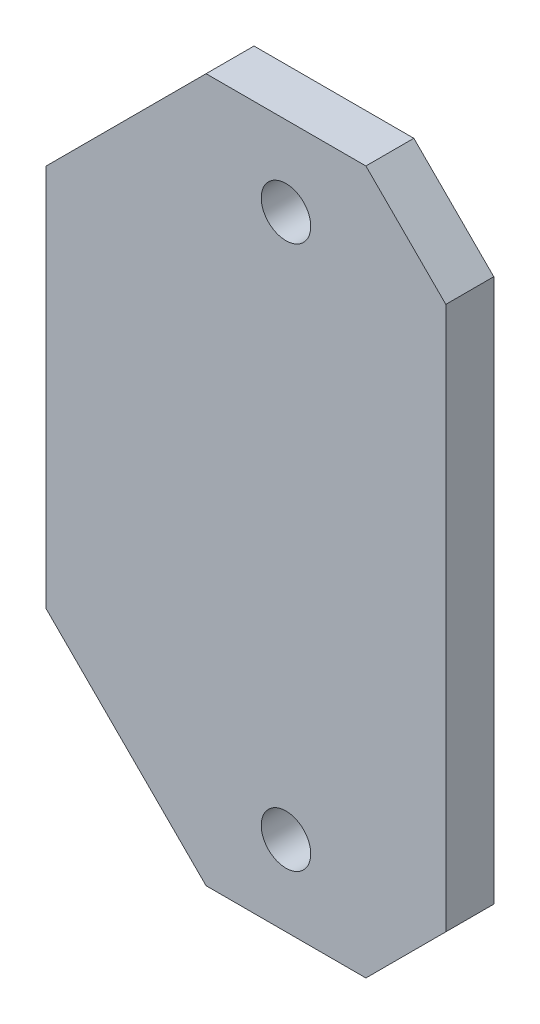
ISO-10303-21;
HEADER;
FILE_DESCRIPTION(('STEP AP214'),'2;1');
FILE_NAME('part.step','',(''),(''),'','','');
FILE_SCHEMA(('AUTOMOTIVE_DESIGN { 1 0 10303 214 1 1 1 1 }'));
ENDSEC;
DATA;
#1=APPLICATION_CONTEXT('core data for automotive mechanical design processes');
#2=APPLICATION_PROTOCOL_DEFINITION('international standard','automotive_design',2000,#1);
#3=PRODUCT_CONTEXT('',#1,'mechanical');
#4=PRODUCT('Part','Part','',(#3));
#5=PRODUCT_RELATED_PRODUCT_CATEGORY('part','',(#4));
#6=PRODUCT_DEFINITION_FORMATION('','',#4);
#7=PRODUCT_DEFINITION_CONTEXT('part definition',#1,'design');
#8=PRODUCT_DEFINITION('design','',#6,#7);
#9=PRODUCT_DEFINITION_SHAPE('','',#8);
#10=(LENGTH_UNIT() NAMED_UNIT(*) SI_UNIT(.MILLI.,.METRE.));
#11=(NAMED_UNIT(*) PLANE_ANGLE_UNIT() SI_UNIT($,.RADIAN.));
#12=(NAMED_UNIT(*) SI_UNIT($,.STERADIAN.) SOLID_ANGLE_UNIT());
#13=UNCERTAINTY_MEASURE_WITH_UNIT(LENGTH_MEASURE(1.E-05),#10,'distance_accuracy_value','');
#14=(GEOMETRIC_REPRESENTATION_CONTEXT(3) GLOBAL_UNCERTAINTY_ASSIGNED_CONTEXT((#13)) GLOBAL_UNIT_ASSIGNED_CONTEXT((#10,
#11,#12)) REPRESENTATION_CONTEXT('',''));
#15=CARTESIAN_POINT('',(0.,0.,0.));
#16=DIRECTION('',(0.,0.,1.));
#17=DIRECTION('',(1.,0.,0.));
#18=AXIS2_PLACEMENT_3D('',#15,#16,#17);
#19=CARTESIAN_POINT('',(-11.6276276276276,19.9519519519519,3.));
#20=DIRECTION('',(1.,0.,0.));
#21=DIRECTION('',(0.,0.,-1.));
#22=AXIS2_PLACEMENT_3D('',#19,#20,#21);
#23=PLANE('',#22);
#24=DIRECTION('',(0.,-1.,0.));
#25=VECTOR('',#24,1.);
#26=CARTESIAN_POINT('',(-11.6276276276276,19.9519519519519,0.));
#27=LINE('',#26,#25);
#28=CARTESIAN_POINT('',(-11.6276276276276,9.95195195195194,0.));
#29=VERTEX_POINT('',#28);
#30=CARTESIAN_POINT('',(-11.6276276276276,-14.048048048048,0.));
#31=VERTEX_POINT('',#30);
#32=EDGE_CURVE('E123',#29,#31,#27,.T.);
#33=ORIENTED_EDGE('',*,*,#32,.T.);
#34=DIRECTION('',(0.,0.,1.));
#35=VECTOR('',#34,1.);
#36=CARTESIAN_POINT('',(-11.6276276276276,-14.048048048048,3.));
#37=LINE('',#36,#35);
#38=CARTESIAN_POINT('',(-11.6276276276276,-14.048048048048,3.));
#39=VERTEX_POINT('',#38);
#40=EDGE_CURVE('E106',#31,#39,#37,.T.);
#41=ORIENTED_EDGE('',*,*,#40,.T.);
#42=DIRECTION('',(0.,-1.,0.));
#43=VECTOR('',#42,1.);
#44=CARTESIAN_POINT('',(-11.6276276276276,19.9519519519519,3.));
#45=LINE('',#44,#43);
#46=CARTESIAN_POINT('',(-11.6276276276276,9.95195195195194,3.));
#47=VERTEX_POINT('',#46);
#48=EDGE_CURVE('E132',#47,#39,#45,.T.);
#49=ORIENTED_EDGE('',*,*,#48,.F.);
#50=DIRECTION('',(0.,0.,-1.));
#51=VECTOR('',#50,1.);
#52=CARTESIAN_POINT('',(-11.6276276276276,9.95195195195194,3.));
#53=LINE('',#52,#51);
#54=EDGE_CURVE('E111',#47,#29,#53,.T.);
#55=ORIENTED_EDGE('',*,*,#54,.T.);
#56=EDGE_LOOP('',(#33,#41,#49,#55));
#57=FACE_BOUND('',#56,.T.);
#58=ADVANCED_FACE('F33',(#57),#23,.F.);
#59=CARTESIAN_POINT('',(-11.6276276276276,-24.0480480480481,3.));
#60=DIRECTION('',(0.,1.,0.));
#61=DIRECTION('',(0.,0.,1.));
#62=AXIS2_PLACEMENT_3D('',#59,#60,#61);
#63=PLANE('',#62);
#64=DIRECTION('',(1.,0.,0.));
#65=VECTOR('',#64,1.);
#66=CARTESIAN_POINT('',(-11.6276276276276,-24.0480480480481,0.));
#67=LINE('',#66,#65);
#68=CARTESIAN_POINT('',(-1.62762762762763,-24.0480480480481,0.));
#69=VERTEX_POINT('',#68);
#70=CARTESIAN_POINT('',(8.37237237237236,-24.0480480480481,0.));
#71=VERTEX_POINT('',#70);
#72=EDGE_CURVE('E115',#69,#71,#67,.T.);
#73=ORIENTED_EDGE('',*,*,#72,.T.);
#74=DIRECTION('',(0.,0.,1.));
#75=VECTOR('',#74,1.);
#76=CARTESIAN_POINT('',(8.37237237237236,-24.0480480480481,3.));
#77=LINE('',#76,#75);
#78=CARTESIAN_POINT('',(8.37237237237236,-24.0480480480481,3.));
#79=VERTEX_POINT('',#78);
#80=EDGE_CURVE('E56',#71,#79,#77,.T.);
#81=ORIENTED_EDGE('',*,*,#80,.T.);
#82=DIRECTION('',(1.,0.,0.));
#83=VECTOR('',#82,1.);
#84=CARTESIAN_POINT('',(-11.6276276276276,-24.0480480480481,3.));
#85=LINE('',#84,#83);
#86=CARTESIAN_POINT('',(-1.62762762762763,-24.0480480480481,3.));
#87=VERTEX_POINT('',#86);
#88=EDGE_CURVE('E116',#87,#79,#85,.T.);
#89=ORIENTED_EDGE('',*,*,#88,.F.);
#90=DIRECTION('',(0.,0.,-1.));
#91=VECTOR('',#90,1.);
#92=CARTESIAN_POINT('',(-1.62762762762763,-24.0480480480481,3.));
#93=LINE('',#92,#91);
#94=EDGE_CURVE('E105',#87,#69,#93,.T.);
#95=ORIENTED_EDGE('',*,*,#94,.T.);
#96=EDGE_LOOP('',(#73,#81,#89,#95));
#97=FACE_BOUND('',#96,.T.);
#98=ADVANCED_FACE('F114',(#97),#63,.F.);
#99=CARTESIAN_POINT('',(13.3723723723724,19.9519519519519,3.));
#100=DIRECTION('',(-1.,0.,0.));
#101=DIRECTION('',(0.,-1.,0.));
#102=AXIS2_PLACEMENT_3D('',#99,#100,#101);
#103=PLANE('',#102);
#104=DIRECTION('',(0.,1.,0.));
#105=VECTOR('',#104,1.);
#106=CARTESIAN_POINT('',(13.3723723723724,19.9519519519519,3.));
#107=LINE('',#106,#105);
#108=CARTESIAN_POINT('',(13.3723723723724,-19.048048048048,3.));
#109=VERTEX_POINT('',#108);
#110=CARTESIAN_POINT('',(13.3723723723724,14.9519519519519,3.));
#111=VERTEX_POINT('',#110);
#112=EDGE_CURVE('E158',#109,#111,#107,.T.);
#113=ORIENTED_EDGE('',*,*,#112,.F.);
#114=DIRECTION('',(0.,0.,-1.));
#115=VECTOR('',#114,1.);
#116=CARTESIAN_POINT('',(13.3723723723724,-19.048048048048,3.));
#117=LINE('',#116,#115);
#118=CARTESIAN_POINT('',(13.3723723723724,-19.048048048048,0.));
#119=VERTEX_POINT('',#118);
#120=EDGE_CURVE('E148',#109,#119,#117,.T.);
#121=ORIENTED_EDGE('',*,*,#120,.T.);
#122=DIRECTION('',(0.,1.,0.));
#123=VECTOR('',#122,1.);
#124=CARTESIAN_POINT('',(13.3723723723724,19.9519519519519,0.));
#125=LINE('',#124,#123);
#126=CARTESIAN_POINT('',(13.3723723723724,14.9519519519519,0.));
#127=VERTEX_POINT('',#126);
#128=EDGE_CURVE('E122',#119,#127,#125,.T.);
#129=ORIENTED_EDGE('',*,*,#128,.T.);
#130=DIRECTION('',(0.,0.,1.));
#131=VECTOR('',#130,1.);
#132=CARTESIAN_POINT('',(13.3723723723724,14.9519519519519,3.));
#133=LINE('',#132,#131);
#134=EDGE_CURVE('E146',#127,#111,#133,.T.);
#135=ORIENTED_EDGE('',*,*,#134,.T.);
#136=EDGE_LOOP('',(#113,#121,#129,#135));
#137=FACE_BOUND('',#136,.T.);
#138=ADVANCED_FACE('F162',(#137),#103,.F.);
#139=CARTESIAN_POINT('',(-11.6276276276276,19.9519519519519,3.));
#140=DIRECTION('',(0.,-1.,0.));
#141=DIRECTION('',(0.,0.,-1.));
#142=AXIS2_PLACEMENT_3D('',#139,#140,#141);
#143=PLANE('',#142);
#144=DIRECTION('',(-1.,0.,0.));
#145=VECTOR('',#144,1.);
#146=CARTESIAN_POINT('',(-11.6276276276276,19.9519519519519,3.));
#147=LINE('',#146,#145);
#148=CARTESIAN_POINT('',(8.37237237237237,19.9519519519519,3.));
#149=VERTEX_POINT('',#148);
#150=CARTESIAN_POINT('',(-1.62762762762759,19.9519519519519,3.));
#151=VERTEX_POINT('',#150);
#152=EDGE_CURVE('E117',#149,#151,#147,.T.);
#153=ORIENTED_EDGE('',*,*,#152,.F.);
#154=DIRECTION('',(0.,0.,-1.));
#155=VECTOR('',#154,1.);
#156=CARTESIAN_POINT('',(8.37237237237237,19.9519519519519,3.));
#157=LINE('',#156,#155);
#158=CARTESIAN_POINT('',(8.37237237237237,19.9519519519519,0.));
#159=VERTEX_POINT('',#158);
#160=EDGE_CURVE('E11',#149,#159,#157,.T.);
#161=ORIENTED_EDGE('',*,*,#160,.T.);
#162=DIRECTION('',(-1.,0.,0.));
#163=VECTOR('',#162,1.);
#164=CARTESIAN_POINT('',(-11.6276276276276,19.9519519519519,0.));
#165=LINE('',#164,#163);
#166=CARTESIAN_POINT('',(-1.62762762762759,19.9519519519519,0.));
#167=VERTEX_POINT('',#166);
#168=EDGE_CURVE('E126',#159,#167,#165,.T.);
#169=ORIENTED_EDGE('',*,*,#168,.T.);
#170=DIRECTION('',(0.,0.,1.));
#171=VECTOR('',#170,1.);
#172=CARTESIAN_POINT('',(-1.62762762762759,19.9519519519519,3.));
#173=LINE('',#172,#171);
#174=EDGE_CURVE('E143',#167,#151,#173,.T.);
#175=ORIENTED_EDGE('',*,*,#174,.T.);
#176=EDGE_LOOP('',(#153,#161,#169,#175));
#177=FACE_BOUND('',#176,.T.);
#178=ADVANCED_FACE('F196',(#177),#143,.F.);
#179=CARTESIAN_POINT('',(0.,0.,3.));
#180=DIRECTION('',(0.,0.,1.));
#181=DIRECTION('',(1.,0.,0.));
#182=AXIS2_PLACEMENT_3D('',#179,#180,#181);
#183=PLANE('',#182);
#184=CARTESIAN_POINT('',(3.37237237237236,-19.048048048048,3.));
#185=DIRECTION('',(0.,0.,1.));
#186=DIRECTION('',(1.,0.,0.));
#187=AXIS2_PLACEMENT_3D('',#184,#185,#186);
#188=CIRCLE('',#187,1.55);
#189=CARTESIAN_POINT('',(4.92237237237236,-19.048048048048,3.));
#190=VERTEX_POINT('',#189);
#191=EDGE_CURVE('E279',#190,#190,#188,.T.);
#192=ORIENTED_EDGE('',*,*,#191,.F.);
#193=EDGE_LOOP('',(#192));
#194=FACE_BOUND('',#193,.T.);
#195=CARTESIAN_POINT('',(3.37237237237239,14.9519519519519,3.));
#196=DIRECTION('',(0.,0.,1.));
#197=DIRECTION('',(1.,0.,0.));
#198=AXIS2_PLACEMENT_3D('',#195,#196,#197);
#199=CIRCLE('',#198,1.55);
#200=CARTESIAN_POINT('',(4.92237237237239,14.9519519519519,3.));
#201=VERTEX_POINT('',#200);
#202=EDGE_CURVE('E281',#201,#201,#199,.T.);
#203=ORIENTED_EDGE('',*,*,#202,.F.);
#204=EDGE_LOOP('',(#203));
#205=FACE_BOUND('',#204,.T.);
#206=ORIENTED_EDGE('',*,*,#88,.T.);
#207=DIRECTION('',(-0.707106781186549,-0.707106781186547,0.));
#208=VECTOR('',#207,1.);
#209=CARTESIAN_POINT('',(16.2102102102102,-16.2102102102102,3.));
#210=LINE('',#209,#208);
#211=EDGE_CURVE('E41',#79,#109,#210,.F.);
#212=ORIENTED_EDGE('',*,*,#211,.T.);
#213=ORIENTED_EDGE('',*,*,#112,.T.);
#214=DIRECTION('',(0.707106781186547,-0.707106781186549,0.));
#215=VECTOR('',#214,1.);
#216=CARTESIAN_POINT('',(14.1621621621622,14.1621621621621,3.));
#217=LINE('',#216,#215);
#218=EDGE_CURVE('E48',#111,#149,#217,.F.);
#219=ORIENTED_EDGE('',*,*,#218,.T.);
#220=ORIENTED_EDGE('',*,*,#152,.T.);
#221=DIRECTION('',(0.707106781186549,0.707106781186546,0.));
#222=VECTOR('',#221,1.);
#223=CARTESIAN_POINT('',(-10.7897897897898,10.7897897897898,3.));
#224=LINE('',#223,#222);
#225=EDGE_CURVE('E139',#151,#47,#224,.F.);
#226=ORIENTED_EDGE('',*,*,#225,.T.);
#227=ORIENTED_EDGE('',*,*,#48,.T.);
#228=DIRECTION('',(-0.707106781186546,0.707106781186549,0.));
#229=VECTOR('',#228,1.);
#230=CARTESIAN_POINT('',(-12.8378378378378,-12.8378378378378,3.));
#231=LINE('',#230,#229);
#232=EDGE_CURVE('E141',#39,#87,#231,.F.);
#233=ORIENTED_EDGE('',*,*,#232,.T.);
#234=EDGE_LOOP('',(#206,#212,#213,#219,#220,#226,#227,#233));
#235=FACE_BOUND('',#234,.T.);
#236=ADVANCED_FACE('F157',(#194,#205,#235),#183,.T.);
#237=CARTESIAN_POINT('',(0.,0.,0.));
#238=DIRECTION('',(0.,0.,1.));
#239=DIRECTION('',(1.,0.,0.));
#240=AXIS2_PLACEMENT_3D('',#237,#238,#239);
#241=PLANE('',#240);
#242=CARTESIAN_POINT('',(3.37237237237236,-19.048048048048,0.));
#243=DIRECTION('',(0.,0.,1.));
#244=DIRECTION('',(1.,0.,0.));
#245=AXIS2_PLACEMENT_3D('',#242,#243,#244);
#246=CIRCLE('',#245,1.55);
#247=CARTESIAN_POINT('',(4.92237237237236,-19.048048048048,0.));
#248=VERTEX_POINT('',#247);
#249=EDGE_CURVE('E276',#248,#248,#246,.T.);
#250=ORIENTED_EDGE('',*,*,#249,.T.);
#251=EDGE_LOOP('',(#250));
#252=FACE_BOUND('',#251,.T.);
#253=CARTESIAN_POINT('',(3.37237237237239,14.9519519519519,0.));
#254=DIRECTION('',(0.,0.,1.));
#255=DIRECTION('',(1.,0.,0.));
#256=AXIS2_PLACEMENT_3D('',#253,#254,#255);
#257=CIRCLE('',#256,1.55);
#258=CARTESIAN_POINT('',(4.92237237237239,14.9519519519519,0.));
#259=VERTEX_POINT('',#258);
#260=EDGE_CURVE('E128',#259,#259,#257,.T.);
#261=ORIENTED_EDGE('',*,*,#260,.T.);
#262=EDGE_LOOP('',(#261));
#263=FACE_BOUND('',#262,.T.);
#264=ORIENTED_EDGE('',*,*,#128,.F.);
#265=DIRECTION('',(0.707106781186549,0.707106781186547,0.));
#266=VECTOR('',#265,1.);
#267=CARTESIAN_POINT('',(13.3723723723724,-19.048048048048,0.));
#268=LINE('',#267,#266);
#269=EDGE_CURVE('E121',#119,#71,#268,.F.);
#270=ORIENTED_EDGE('',*,*,#269,.T.);
#271=ORIENTED_EDGE('',*,*,#72,.F.);
#272=DIRECTION('',(0.707106781186546,-0.707106781186549,0.));
#273=VECTOR('',#272,1.);
#274=CARTESIAN_POINT('',(-1.62762762762763,-24.0480480480481,0.));
#275=LINE('',#274,#273);
#276=EDGE_CURVE('E101',#69,#31,#275,.F.);
#277=ORIENTED_EDGE('',*,*,#276,.T.);
#278=ORIENTED_EDGE('',*,*,#32,.F.);
#279=DIRECTION('',(-0.707106781186549,-0.707106781186546,0.));
#280=VECTOR('',#279,1.);
#281=CARTESIAN_POINT('',(-11.6276276276276,9.95195195195194,0.));
#282=LINE('',#281,#280);
#283=EDGE_CURVE('E112',#29,#167,#282,.F.);
#284=ORIENTED_EDGE('',*,*,#283,.T.);
#285=ORIENTED_EDGE('',*,*,#168,.F.);
#286=DIRECTION('',(-0.707106781186547,0.707106781186549,0.));
#287=VECTOR('',#286,1.);
#288=CARTESIAN_POINT('',(8.37237237237237,19.9519519519519,0.));
#289=LINE('',#288,#287);
#290=EDGE_CURVE('E151',#159,#127,#289,.F.);
#291=ORIENTED_EDGE('',*,*,#290,.T.);
#292=EDGE_LOOP('',(#264,#270,#271,#277,#278,#284,#285,#291));
#293=FACE_BOUND('',#292,.T.);
#294=ADVANCED_FACE('F120',(#252,#263,#293),#241,.F.);
#295=CARTESIAN_POINT('',(-1.62762762762763,-24.0480480480481,3.));
#296=DIRECTION('',(0.707106781186549,0.707106781186546,0.));
#297=DIRECTION('',(0.,0.,-1.));
#298=AXIS2_PLACEMENT_3D('',#295,#296,#297);
#299=PLANE('',#298);
#300=ORIENTED_EDGE('',*,*,#232,.F.);
#301=ORIENTED_EDGE('',*,*,#40,.F.);
#302=ORIENTED_EDGE('',*,*,#276,.F.);
#303=ORIENTED_EDGE('',*,*,#94,.F.);
#304=EDGE_LOOP('',(#300,#301,#302,#303));
#305=FACE_BOUND('',#304,.T.);
#306=ADVANCED_FACE('F104',(#305),#299,.F.);
#307=CARTESIAN_POINT('',(-11.6276276276276,9.95195195195194,3.));
#308=DIRECTION('',(0.707106781186546,-0.707106781186549,0.));
#309=DIRECTION('',(0.,0.,-1.));
#310=AXIS2_PLACEMENT_3D('',#307,#308,#309);
#311=PLANE('',#310);
#312=ORIENTED_EDGE('',*,*,#225,.F.);
#313=ORIENTED_EDGE('',*,*,#174,.F.);
#314=ORIENTED_EDGE('',*,*,#283,.F.);
#315=ORIENTED_EDGE('',*,*,#54,.F.);
#316=EDGE_LOOP('',(#312,#313,#314,#315));
#317=FACE_BOUND('',#316,.T.);
#318=ADVANCED_FACE('F167',(#317),#311,.F.);
#319=CARTESIAN_POINT('',(13.3723723723724,-19.048048048048,3.));
#320=DIRECTION('',(-0.707106781186547,0.707106781186549,0.));
#321=DIRECTION('',(0.,0.,-1.));
#322=AXIS2_PLACEMENT_3D('',#319,#320,#321);
#323=PLANE('',#322);
#324=ORIENTED_EDGE('',*,*,#211,.F.);
#325=ORIENTED_EDGE('',*,*,#80,.F.);
#326=ORIENTED_EDGE('',*,*,#269,.F.);
#327=ORIENTED_EDGE('',*,*,#120,.F.);
#328=EDGE_LOOP('',(#324,#325,#326,#327));
#329=FACE_BOUND('',#328,.T.);
#330=ADVANCED_FACE('F165',(#329),#323,.F.);
#331=CARTESIAN_POINT('',(8.37237237237237,19.9519519519519,3.));
#332=DIRECTION('',(-0.707106781186548,-0.707106781186546,0.));
#333=DIRECTION('',(0.,0.,-1.));
#334=AXIS2_PLACEMENT_3D('',#331,#332,#333);
#335=PLANE('',#334);
#336=ORIENTED_EDGE('',*,*,#218,.F.);
#337=ORIENTED_EDGE('',*,*,#134,.F.);
#338=ORIENTED_EDGE('',*,*,#290,.F.);
#339=ORIENTED_EDGE('',*,*,#160,.F.);
#340=EDGE_LOOP('',(#336,#337,#338,#339));
#341=FACE_BOUND('',#340,.T.);
#342=ADVANCED_FACE('F35',(#341),#335,.F.);
#343=CARTESIAN_POINT('',(3.37237237237239,14.9519519519519,0.));
#344=DIRECTION('',(0.,0.,1.));
#345=DIRECTION('',(1.,0.,0.));
#346=AXIS2_PLACEMENT_3D('',#343,#344,#345);
#347=CYLINDRICAL_SURFACE('',#346,1.55);
#348=ORIENTED_EDGE('',*,*,#260,.F.);
#349=EDGE_LOOP('',(#348));
#350=FACE_BOUND('',#349,.T.);
#351=ORIENTED_EDGE('',*,*,#202,.T.);
#352=EDGE_LOOP('',(#351));
#353=FACE_BOUND('',#352,.T.);
#354=ADVANCED_FACE('F172',(#350,#353),#347,.F.);
#355=CARTESIAN_POINT('',(3.37237237237236,-19.048048048048,0.));
#356=DIRECTION('',(0.,0.,1.));
#357=DIRECTION('',(1.,0.,0.));
#358=AXIS2_PLACEMENT_3D('',#355,#356,#357);
#359=CYLINDRICAL_SURFACE('',#358,1.55);
#360=ORIENTED_EDGE('',*,*,#249,.F.);
#361=EDGE_LOOP('',(#360));
#362=FACE_BOUND('',#361,.T.);
#363=ORIENTED_EDGE('',*,*,#191,.T.);
#364=EDGE_LOOP('',(#363));
#365=FACE_BOUND('',#364,.T.);
#366=ADVANCED_FACE('F261',(#362,#365),#359,.F.);
#367=CLOSED_SHELL('',(#58,#98,#138,#178,#236,#294,#306,#318,#330,#342,#354,#366));
#368=MANIFOLD_SOLID_BREP('B2',#367);
#369=ADVANCED_BREP_SHAPE_REPRESENTATION('',(#18,#368),#14);
#370=SHAPE_DEFINITION_REPRESENTATION(#9,#369);
ENDSEC;
END-ISO-10303-21;
